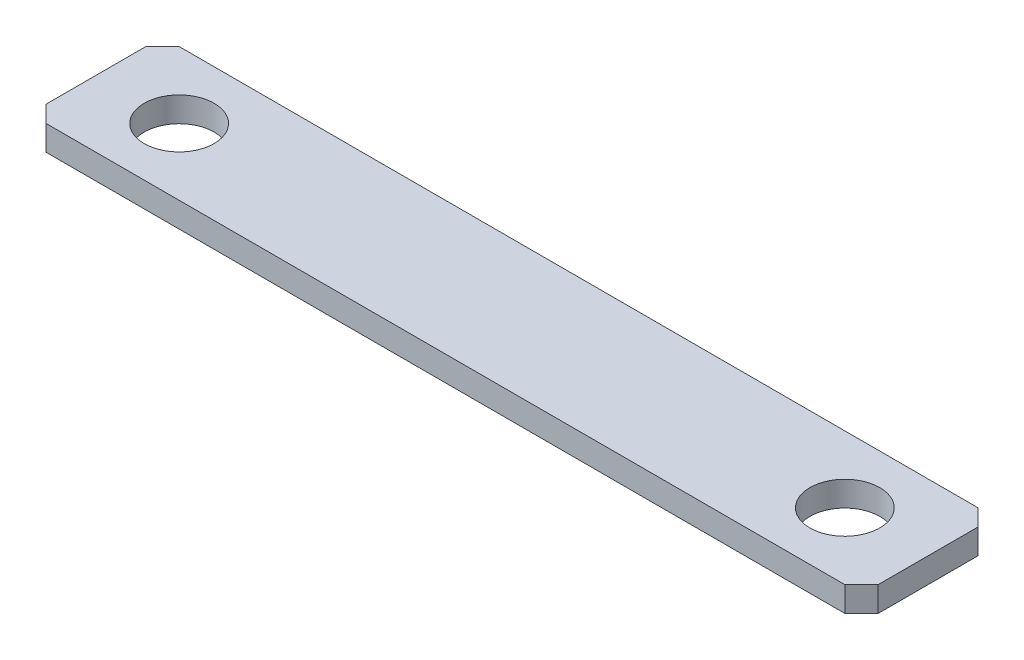
ISO-10303-21;
HEADER;
FILE_DESCRIPTION(('STEP AP214'),'2;1');
FILE_NAME('part.step','',(''),(''),'','','');
FILE_SCHEMA(('AUTOMOTIVE_DESIGN { 1 0 10303 214 1 1 1 1 }'));
ENDSEC;
DATA;
#1=APPLICATION_CONTEXT('core data for automotive mechanical design processes');
#2=APPLICATION_PROTOCOL_DEFINITION('international standard','automotive_design',2000,#1);
#3=PRODUCT_CONTEXT('',#1,'mechanical');
#4=PRODUCT('Part','Part','',(#3));
#5=PRODUCT_RELATED_PRODUCT_CATEGORY('part','',(#4));
#6=PRODUCT_DEFINITION_FORMATION('','',#4);
#7=PRODUCT_DEFINITION_CONTEXT('part definition',#1,'design');
#8=PRODUCT_DEFINITION('design','',#6,#7);
#9=PRODUCT_DEFINITION_SHAPE('','',#8);
#10=(LENGTH_UNIT() NAMED_UNIT(*) SI_UNIT(.MILLI.,.METRE.));
#11=(NAMED_UNIT(*) PLANE_ANGLE_UNIT() SI_UNIT($,.RADIAN.));
#12=(NAMED_UNIT(*) SI_UNIT($,.STERADIAN.) SOLID_ANGLE_UNIT());
#13=UNCERTAINTY_MEASURE_WITH_UNIT(LENGTH_MEASURE(1.E-05),#10,'distance_accuracy_value','');
#14=(GEOMETRIC_REPRESENTATION_CONTEXT(3) GLOBAL_UNCERTAINTY_ASSIGNED_CONTEXT((#13)) GLOBAL_UNIT_ASSIGNED_CONTEXT((#10,
#11,#12)) REPRESENTATION_CONTEXT('',''));
#15=CARTESIAN_POINT('',(0.,0.,0.));
#16=DIRECTION('',(0.,0.,1.));
#17=DIRECTION('',(1.,0.,0.));
#18=AXIS2_PLACEMENT_3D('',#15,#16,#17);
#19=CARTESIAN_POINT('',(25.,1.5,-4.));
#20=DIRECTION('',(-1.,0.,0.));
#21=DIRECTION('',(0.,0.,1.));
#22=AXIS2_PLACEMENT_3D('',#19,#20,#21);
#23=PLANE('',#22);
#24=DIRECTION('',(0.,0.,-1.));
#25=VECTOR('',#24,1.);
#26=CARTESIAN_POINT('',(25.,1.5,-4.));
#27=LINE('',#26,#25);
#28=CARTESIAN_POINT('',(25.,1.5,3.));
#29=VERTEX_POINT('',#28);
#30=CARTESIAN_POINT('',(25.,1.5,-3.));
#31=VERTEX_POINT('',#30);
#32=EDGE_CURVE('E120',#29,#31,#27,.T.);
#33=ORIENTED_EDGE('',*,*,#32,.F.);
#34=DIRECTION('',(0.,-1.,0.));
#35=VECTOR('',#34,1.);
#36=CARTESIAN_POINT('',(25.,1.5,3.));
#37=LINE('',#36,#35);
#38=CARTESIAN_POINT('',(25.,0.,3.));
#39=VERTEX_POINT('',#38);
#40=EDGE_CURVE('E105',#29,#39,#37,.T.);
#41=ORIENTED_EDGE('',*,*,#40,.T.);
#42=DIRECTION('',(0.,0.,-1.));
#43=VECTOR('',#42,1.);
#44=CARTESIAN_POINT('',(25.,0.,-4.));
#45=LINE('',#44,#43);
#46=CARTESIAN_POINT('',(25.,0.,-3.));
#47=VERTEX_POINT('',#46);
#48=EDGE_CURVE('E117',#39,#47,#45,.T.);
#49=ORIENTED_EDGE('',*,*,#48,.T.);
#50=DIRECTION('',(0.,1.,0.));
#51=VECTOR('',#50,1.);
#52=CARTESIAN_POINT('',(25.,1.5,-3.));
#53=LINE('',#52,#51);
#54=EDGE_CURVE('E122',#47,#31,#53,.T.);
#55=ORIENTED_EDGE('',*,*,#54,.T.);
#56=EDGE_LOOP('',(#33,#41,#49,#55));
#57=FACE_BOUND('',#56,.T.);
#58=ADVANCED_FACE('F35',(#57),#23,.F.);
#59=CARTESIAN_POINT('',(-25.,1.5,-4.));
#60=DIRECTION('',(0.,0.,1.));
#61=DIRECTION('',(1.,0.,0.));
#62=AXIS2_PLACEMENT_3D('',#59,#60,#61);
#63=PLANE('',#62);
#64=DIRECTION('',(-1.,0.,0.));
#65=VECTOR('',#64,1.);
#66=CARTESIAN_POINT('',(-25.,1.5,-4.));
#67=LINE('',#66,#65);
#68=CARTESIAN_POINT('',(24.,1.5,-4.));
#69=VERTEX_POINT('',#68);
#70=CARTESIAN_POINT('',(-24.,1.5,-4.));
#71=VERTEX_POINT('',#70);
#72=EDGE_CURVE('E166',#69,#71,#67,.T.);
#73=ORIENTED_EDGE('',*,*,#72,.F.);
#74=DIRECTION('',(0.,-1.,0.));
#75=VECTOR('',#74,1.);
#76=CARTESIAN_POINT('',(24.,1.5,-4.));
#77=LINE('',#76,#75);
#78=CARTESIAN_POINT('',(24.,0.,-4.));
#79=VERTEX_POINT('',#78);
#80=EDGE_CURVE('E159',#69,#79,#77,.T.);
#81=ORIENTED_EDGE('',*,*,#80,.T.);
#82=DIRECTION('',(-1.,0.,0.));
#83=VECTOR('',#82,1.);
#84=CARTESIAN_POINT('',(-25.,0.,-4.));
#85=LINE('',#84,#83);
#86=CARTESIAN_POINT('',(-24.,0.,-4.));
#87=VERTEX_POINT('',#86);
#88=EDGE_CURVE('E126',#79,#87,#85,.T.);
#89=ORIENTED_EDGE('',*,*,#88,.T.);
#90=DIRECTION('',(0.,1.,0.));
#91=VECTOR('',#90,1.);
#92=CARTESIAN_POINT('',(-24.,1.5,-4.));
#93=LINE('',#92,#91);
#94=EDGE_CURVE('E157',#87,#71,#93,.T.);
#95=ORIENTED_EDGE('',*,*,#94,.T.);
#96=EDGE_LOOP('',(#73,#81,#89,#95));
#97=FACE_BOUND('',#96,.T.);
#98=ADVANCED_FACE('F164',(#97),#63,.F.);
#99=CARTESIAN_POINT('',(-25.,1.5,-4.));
#100=DIRECTION('',(1.,0.,0.));
#101=DIRECTION('',(0.,0.,-1.));
#102=AXIS2_PLACEMENT_3D('',#99,#100,#101);
#103=PLANE('',#102);
#104=DIRECTION('',(0.,0.,1.));
#105=VECTOR('',#104,1.);
#106=CARTESIAN_POINT('',(-25.,1.5,-4.));
#107=LINE('',#106,#105);
#108=CARTESIAN_POINT('',(-25.,1.5,-2.99999999999999));
#109=VERTEX_POINT('',#108);
#110=CARTESIAN_POINT('',(-25.,1.5,3.00000000000001));
#111=VERTEX_POINT('',#110);
#112=EDGE_CURVE('E174',#109,#111,#107,.T.);
#113=ORIENTED_EDGE('',*,*,#112,.F.);
#114=DIRECTION('',(0.,-1.,0.));
#115=VECTOR('',#114,1.);
#116=CARTESIAN_POINT('',(-25.,1.5,-2.99999999999999));
#117=LINE('',#116,#115);
#118=CARTESIAN_POINT('',(-25.,0.,-2.99999999999999));
#119=VERTEX_POINT('',#118);
#120=EDGE_CURVE('E11',#109,#119,#117,.T.);
#121=ORIENTED_EDGE('',*,*,#120,.T.);
#122=DIRECTION('',(0.,0.,1.));
#123=VECTOR('',#122,1.);
#124=CARTESIAN_POINT('',(-25.,0.,-4.));
#125=LINE('',#124,#123);
#126=CARTESIAN_POINT('',(-25.,0.,3.00000000000001));
#127=VERTEX_POINT('',#126);
#128=EDGE_CURVE('E130',#119,#127,#125,.T.);
#129=ORIENTED_EDGE('',*,*,#128,.T.);
#130=DIRECTION('',(0.,1.,0.));
#131=VECTOR('',#130,1.);
#132=CARTESIAN_POINT('',(-25.,1.5,3.00000000000001));
#133=LINE('',#132,#131);
#134=EDGE_CURVE('E43',#127,#111,#133,.T.);
#135=ORIENTED_EDGE('',*,*,#134,.T.);
#136=EDGE_LOOP('',(#113,#121,#129,#135));
#137=FACE_BOUND('',#136,.T.);
#138=ADVANCED_FACE('F173',(#137),#103,.F.);
#139=CARTESIAN_POINT('',(-25.,1.5,4.));
#140=DIRECTION('',(0.,0.,-1.));
#141=DIRECTION('',(-1.,0.,0.));
#142=AXIS2_PLACEMENT_3D('',#139,#140,#141);
#143=PLANE('',#142);
#144=DIRECTION('',(1.,0.,0.));
#145=VECTOR('',#144,1.);
#146=CARTESIAN_POINT('',(-25.,0.,4.));
#147=LINE('',#146,#145);
#148=CARTESIAN_POINT('',(-24.,0.,4.));
#149=VERTEX_POINT('',#148);
#150=CARTESIAN_POINT('',(24.,0.,4.));
#151=VERTEX_POINT('',#150);
#152=EDGE_CURVE('E140',#149,#151,#147,.T.);
#153=ORIENTED_EDGE('',*,*,#152,.T.);
#154=DIRECTION('',(0.,1.,0.));
#155=VECTOR('',#154,1.);
#156=CARTESIAN_POINT('',(24.,1.5,4.));
#157=LINE('',#156,#155);
#158=CARTESIAN_POINT('',(24.,1.5,4.));
#159=VERTEX_POINT('',#158);
#160=EDGE_CURVE('E106',#151,#159,#157,.T.);
#161=ORIENTED_EDGE('',*,*,#160,.T.);
#162=DIRECTION('',(1.,0.,0.));
#163=VECTOR('',#162,1.);
#164=CARTESIAN_POINT('',(-25.,1.5,4.));
#165=LINE('',#164,#163);
#166=CARTESIAN_POINT('',(-24.,1.5,4.));
#167=VERTEX_POINT('',#166);
#168=EDGE_CURVE('E136',#167,#159,#165,.T.);
#169=ORIENTED_EDGE('',*,*,#168,.F.);
#170=DIRECTION('',(0.,-1.,0.));
#171=VECTOR('',#170,1.);
#172=CARTESIAN_POINT('',(-24.,1.5,4.));
#173=LINE('',#172,#171);
#174=EDGE_CURVE('E111',#167,#149,#173,.T.);
#175=ORIENTED_EDGE('',*,*,#174,.T.);
#176=EDGE_LOOP('',(#153,#161,#169,#175));
#177=FACE_BOUND('',#176,.T.);
#178=ADVANCED_FACE('F194',(#177),#143,.F.);
#179=CARTESIAN_POINT('',(0.,1.5,0.));
#180=DIRECTION('',(0.,1.,0.));
#181=DIRECTION('',(0.,0.,1.));
#182=AXIS2_PLACEMENT_3D('',#179,#180,#181);
#183=PLANE('',#182);
#184=CARTESIAN_POINT('',(-20.,1.5,0.));
#185=DIRECTION('',(0.,1.,0.));
#186=DIRECTION('',(0.,0.,1.));
#187=AXIS2_PLACEMENT_3D('',#184,#185,#186);
#188=CIRCLE('',#187,2.1);
#189=CARTESIAN_POINT('',(-20.,1.5,2.1));
#190=VERTEX_POINT('',#189);
#191=EDGE_CURVE('E133',#190,#190,#188,.T.);
#192=ORIENTED_EDGE('',*,*,#191,.F.);
#193=EDGE_LOOP('',(#192));
#194=FACE_BOUND('',#193,.T.);
#195=CARTESIAN_POINT('',(20.,1.5,0.));
#196=DIRECTION('',(0.,1.,0.));
#197=DIRECTION('',(0.,0.,-1.));
#198=AXIS2_PLACEMENT_3D('',#195,#196,#197);
#199=CIRCLE('',#198,2.1);
#200=CARTESIAN_POINT('',(20.,1.5,-2.1));
#201=VERTEX_POINT('',#200);
#202=EDGE_CURVE('E180',#201,#201,#199,.T.);
#203=ORIENTED_EDGE('',*,*,#202,.F.);
#204=EDGE_LOOP('',(#203));
#205=FACE_BOUND('',#204,.T.);
#206=ORIENTED_EDGE('',*,*,#168,.T.);
#207=DIRECTION('',(-0.70710678118655,0.,0.707106781186545));
#208=VECTOR('',#207,1.);
#209=CARTESIAN_POINT('',(13.9999999999999,1.5,14.));
#210=LINE('',#209,#208);
#211=EDGE_CURVE('E155',#159,#29,#210,.F.);
#212=ORIENTED_EDGE('',*,*,#211,.T.);
#213=ORIENTED_EDGE('',*,*,#32,.T.);
#214=DIRECTION('',(0.707106781186545,0.,0.70710678118655));
#215=VECTOR('',#214,1.);
#216=CARTESIAN_POINT('',(14.0000000000001,1.5,-14.));
#217=LINE('',#216,#215);
#218=EDGE_CURVE('E153',#31,#69,#217,.F.);
#219=ORIENTED_EDGE('',*,*,#218,.T.);
#220=ORIENTED_EDGE('',*,*,#72,.T.);
#221=DIRECTION('',(0.707106781186548,0.,-0.707106781186548));
#222=VECTOR('',#221,1.);
#223=CARTESIAN_POINT('',(-14.,1.5,-14.));
#224=LINE('',#223,#222);
#225=EDGE_CURVE('E56',#71,#109,#224,.F.);
#226=ORIENTED_EDGE('',*,*,#225,.T.);
#227=ORIENTED_EDGE('',*,*,#112,.T.);
#228=DIRECTION('',(-0.707106781186548,0.,-0.707106781186548));
#229=VECTOR('',#228,1.);
#230=CARTESIAN_POINT('',(-14.,1.5,14.));
#231=LINE('',#230,#229);
#232=EDGE_CURVE('E150',#111,#167,#231,.F.);
#233=ORIENTED_EDGE('',*,*,#232,.T.);
#234=EDGE_LOOP('',(#206,#212,#213,#219,#220,#226,#227,#233));
#235=FACE_BOUND('',#234,.T.);
#236=ADVANCED_FACE('F191',(#194,#205,#235),#183,.T.);
#237=CARTESIAN_POINT('',(0.,0.,0.));
#238=DIRECTION('',(0.,1.,0.));
#239=DIRECTION('',(0.,0.,1.));
#240=AXIS2_PLACEMENT_3D('',#237,#238,#239);
#241=PLANE('',#240);
#242=CARTESIAN_POINT('',(-20.,0.,0.));
#243=DIRECTION('',(0.,1.,0.));
#244=DIRECTION('',(0.,0.,1.));
#245=AXIS2_PLACEMENT_3D('',#242,#243,#244);
#246=CIRCLE('',#245,2.1);
#247=CARTESIAN_POINT('',(-20.,0.,2.1));
#248=VERTEX_POINT('',#247);
#249=EDGE_CURVE('E127',#248,#248,#246,.T.);
#250=ORIENTED_EDGE('',*,*,#249,.T.);
#251=EDGE_LOOP('',(#250));
#252=FACE_BOUND('',#251,.T.);
#253=CARTESIAN_POINT('',(20.,0.,0.));
#254=DIRECTION('',(0.,1.,0.));
#255=DIRECTION('',(0.,0.,-1.));
#256=AXIS2_PLACEMENT_3D('',#253,#254,#255);
#257=CIRCLE('',#256,2.1);
#258=CARTESIAN_POINT('',(20.,0.,-2.1));
#259=VERTEX_POINT('',#258);
#260=EDGE_CURVE('E183',#259,#259,#257,.T.);
#261=ORIENTED_EDGE('',*,*,#260,.T.);
#262=EDGE_LOOP('',(#261));
#263=FACE_BOUND('',#262,.T.);
#264=ORIENTED_EDGE('',*,*,#48,.F.);
#265=DIRECTION('',(0.70710678118655,0.,-0.707106781186545));
#266=VECTOR('',#265,1.);
#267=CARTESIAN_POINT('',(25.,0.,3.));
#268=LINE('',#267,#266);
#269=EDGE_CURVE('E101',#39,#151,#268,.F.);
#270=ORIENTED_EDGE('',*,*,#269,.T.);
#271=ORIENTED_EDGE('',*,*,#152,.F.);
#272=DIRECTION('',(0.707106781186548,0.,0.707106781186548));
#273=VECTOR('',#272,1.);
#274=CARTESIAN_POINT('',(-24.,0.,4.));
#275=LINE('',#274,#273);
#276=EDGE_CURVE('E121',#149,#127,#275,.F.);
#277=ORIENTED_EDGE('',*,*,#276,.T.);
#278=ORIENTED_EDGE('',*,*,#128,.F.);
#279=DIRECTION('',(-0.707106781186548,0.,0.707106781186548));
#280=VECTOR('',#279,1.);
#281=CARTESIAN_POINT('',(-25.,0.,-2.99999999999999));
#282=LINE('',#281,#280);
#283=EDGE_CURVE('E144',#119,#87,#282,.F.);
#284=ORIENTED_EDGE('',*,*,#283,.T.);
#285=ORIENTED_EDGE('',*,*,#88,.F.);
#286=DIRECTION('',(-0.707106781186545,0.,-0.70710678118655));
#287=VECTOR('',#286,1.);
#288=CARTESIAN_POINT('',(24.,0.,-4.));
#289=LINE('',#288,#287);
#290=EDGE_CURVE('E112',#79,#47,#289,.F.);
#291=ORIENTED_EDGE('',*,*,#290,.T.);
#292=EDGE_LOOP('',(#264,#270,#271,#277,#278,#284,#285,#291));
#293=FACE_BOUND('',#292,.T.);
#294=ADVANCED_FACE('F124',(#252,#263,#293),#241,.F.);
#295=CARTESIAN_POINT('',(20.,0.,0.));
#296=DIRECTION('',(0.,1.,0.));
#297=DIRECTION('',(0.,0.,1.));
#298=AXIS2_PLACEMENT_3D('',#295,#296,#297);
#299=CYLINDRICAL_SURFACE('',#298,2.1);
#300=ORIENTED_EDGE('',*,*,#260,.F.);
#301=EDGE_LOOP('',(#300));
#302=FACE_BOUND('',#301,.T.);
#303=ORIENTED_EDGE('',*,*,#202,.T.);
#304=EDGE_LOOP('',(#303));
#305=FACE_BOUND('',#304,.T.);
#306=ADVANCED_FACE('F246',(#302,#305),#299,.F.);
#307=CARTESIAN_POINT('',(-20.,0.,0.));
#308=DIRECTION('',(0.,1.,0.));
#309=DIRECTION('',(0.,0.,1.));
#310=AXIS2_PLACEMENT_3D('',#307,#308,#309);
#311=CYLINDRICAL_SURFACE('',#310,2.1);
#312=ORIENTED_EDGE('',*,*,#249,.F.);
#313=EDGE_LOOP('',(#312));
#314=FACE_BOUND('',#313,.T.);
#315=ORIENTED_EDGE('',*,*,#191,.T.);
#316=EDGE_LOOP('',(#315));
#317=FACE_BOUND('',#316,.T.);
#318=ADVANCED_FACE('F189',(#314,#317),#311,.F.);
#319=CARTESIAN_POINT('',(25.,1.5,3.));
#320=DIRECTION('',(-0.707106781186545,0.,-0.70710678118655));
#321=DIRECTION('',(0.,-1.,0.));
#322=AXIS2_PLACEMENT_3D('',#319,#320,#321);
#323=PLANE('',#322);
#324=ORIENTED_EDGE('',*,*,#211,.F.);
#325=ORIENTED_EDGE('',*,*,#160,.F.);
#326=ORIENTED_EDGE('',*,*,#269,.F.);
#327=ORIENTED_EDGE('',*,*,#40,.F.);
#328=EDGE_LOOP('',(#324,#325,#326,#327));
#329=FACE_BOUND('',#328,.T.);
#330=ADVANCED_FACE('F104',(#329),#323,.F.);
#331=CARTESIAN_POINT('',(24.,1.5,-4.));
#332=DIRECTION('',(-0.70710678118655,0.,0.707106781186545));
#333=DIRECTION('',(0.,-1.,0.));
#334=AXIS2_PLACEMENT_3D('',#331,#332,#333);
#335=PLANE('',#334);
#336=ORIENTED_EDGE('',*,*,#218,.F.);
#337=ORIENTED_EDGE('',*,*,#54,.F.);
#338=ORIENTED_EDGE('',*,*,#290,.F.);
#339=ORIENTED_EDGE('',*,*,#80,.F.);
#340=EDGE_LOOP('',(#336,#337,#338,#339));
#341=FACE_BOUND('',#340,.T.);
#342=ADVANCED_FACE('F205',(#341),#335,.F.);
#343=CARTESIAN_POINT('',(-25.,1.5,-2.99999999999999));
#344=DIRECTION('',(0.707106781186547,0.,0.707106781186547));
#345=DIRECTION('',(0.,-1.,0.));
#346=AXIS2_PLACEMENT_3D('',#343,#344,#345);
#347=PLANE('',#346);
#348=ORIENTED_EDGE('',*,*,#225,.F.);
#349=ORIENTED_EDGE('',*,*,#94,.F.);
#350=ORIENTED_EDGE('',*,*,#283,.F.);
#351=ORIENTED_EDGE('',*,*,#120,.F.);
#352=EDGE_LOOP('',(#348,#349,#350,#351));
#353=FACE_BOUND('',#352,.T.);
#354=ADVANCED_FACE('F172',(#353),#347,.F.);
#355=CARTESIAN_POINT('',(-24.,1.5,4.));
#356=DIRECTION('',(0.707106781186547,0.,-0.707106781186547));
#357=DIRECTION('',(0.,-1.,0.));
#358=AXIS2_PLACEMENT_3D('',#355,#356,#357);
#359=PLANE('',#358);
#360=ORIENTED_EDGE('',*,*,#232,.F.);
#361=ORIENTED_EDGE('',*,*,#134,.F.);
#362=ORIENTED_EDGE('',*,*,#276,.F.);
#363=ORIENTED_EDGE('',*,*,#174,.F.);
#364=EDGE_LOOP('',(#360,#361,#362,#363));
#365=FACE_BOUND('',#364,.T.);
#366=ADVANCED_FACE('F37',(#365),#359,.F.);
#367=CLOSED_SHELL('',(#58,#98,#138,#178,#236,#294,#306,#318,#330,#342,#354,#366));
#368=MANIFOLD_SOLID_BREP('B2',#367);
#369=ADVANCED_BREP_SHAPE_REPRESENTATION('',(#18,#368),#14);
#370=SHAPE_DEFINITION_REPRESENTATION(#9,#369);
ENDSEC;
END-ISO-10303-21;
